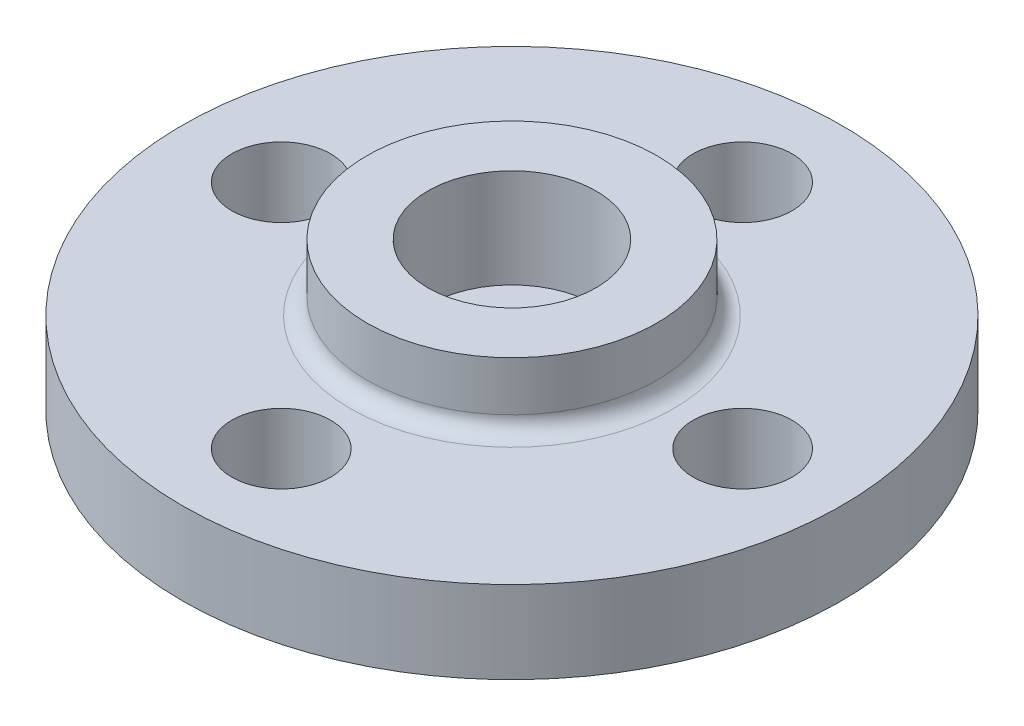
ISO-10303-21;
HEADER;
FILE_DESCRIPTION(('STEP AP214'),'2;1');
FILE_NAME('part.step','',(''),(''),'','','');
FILE_SCHEMA(('AUTOMOTIVE_DESIGN { 1 0 10303 214 1 1 1 1 }'));
ENDSEC;
DATA;
#1=APPLICATION_CONTEXT('core data for automotive mechanical design processes');
#2=APPLICATION_PROTOCOL_DEFINITION('international standard','automotive_design',2000,#1);
#3=PRODUCT_CONTEXT('',#1,'mechanical');
#4=PRODUCT('Part','Part','',(#3));
#5=PRODUCT_RELATED_PRODUCT_CATEGORY('part','',(#4));
#6=PRODUCT_DEFINITION_FORMATION('','',#4);
#7=PRODUCT_DEFINITION_CONTEXT('part definition',#1,'design');
#8=PRODUCT_DEFINITION('design','',#6,#7);
#9=PRODUCT_DEFINITION_SHAPE('','',#8);
#10=(LENGTH_UNIT() NAMED_UNIT(*) SI_UNIT(.MILLI.,.METRE.));
#11=(NAMED_UNIT(*) PLANE_ANGLE_UNIT() SI_UNIT($,.RADIAN.));
#12=(NAMED_UNIT(*) SI_UNIT($,.STERADIAN.) SOLID_ANGLE_UNIT());
#13=UNCERTAINTY_MEASURE_WITH_UNIT(LENGTH_MEASURE(1.E-05),#10,'distance_accuracy_value','');
#14=(GEOMETRIC_REPRESENTATION_CONTEXT(3) GLOBAL_UNCERTAINTY_ASSIGNED_CONTEXT((#13)) GLOBAL_UNIT_ASSIGNED_CONTEXT((#10,
#11,#12)) REPRESENTATION_CONTEXT('',''));
#15=CARTESIAN_POINT('',(0.,0.,0.));
#16=DIRECTION('',(0.,0.,1.));
#17=DIRECTION('',(1.,0.,0.));
#18=AXIS2_PLACEMENT_3D('',#15,#16,#17);
#19=CARTESIAN_POINT('',(0.,2.5,0.));
#20=DIRECTION('',(0.,-1.,0.));
#21=DIRECTION('',(0.,0.,-1.));
#22=AXIS2_PLACEMENT_3D('',#19,#20,#21);
#23=CYLINDRICAL_SURFACE('',#22,1.5);
#24=CARTESIAN_POINT('',(0.,0.,0.));
#25=DIRECTION('',(0.,1.,0.));
#26=DIRECTION('',(0.,0.,1.));
#27=AXIS2_PLACEMENT_3D('',#24,#25,#26);
#28=CIRCLE('',#27,1.5);
#29=CARTESIAN_POINT('',(0.,0.,1.5));
#30=VERTEX_POINT('',#29);
#31=EDGE_CURVE('E74',#30,#30,#28,.T.);
#32=ORIENTED_EDGE('',*,*,#31,.F.);
#33=EDGE_LOOP('',(#32));
#34=FACE_BOUND('',#33,.T.);
#35=CARTESIAN_POINT('',(0.,1.5,0.));
#36=DIRECTION('',(0.,1.,0.));
#37=DIRECTION('',(0.,0.,1.));
#38=AXIS2_PLACEMENT_3D('',#35,#36,#37);
#39=CIRCLE('',#38,1.5);
#40=CARTESIAN_POINT('',(0.,1.5,1.5));
#41=VERTEX_POINT('',#40);
#42=EDGE_CURVE('E36',#41,#41,#39,.T.);
#43=ORIENTED_EDGE('',*,*,#42,.T.);
#44=EDGE_LOOP('',(#43));
#45=FACE_BOUND('',#44,.T.);
#46=ADVANCED_FACE('F32',(#34,#45),#23,.F.);
#47=CARTESIAN_POINT('',(0.,2.5,0.));
#48=DIRECTION('',(0.,1.,0.));
#49=DIRECTION('',(0.,0.,1.));
#50=AXIS2_PLACEMENT_3D('',#47,#48,#49);
#51=PLANE('',#50);
#52=CARTESIAN_POINT('',(0.,2.5,0.));
#53=DIRECTION('',(0.,1.,0.));
#54=DIRECTION('',(0.,0.,1.));
#55=AXIS2_PLACEMENT_3D('',#52,#53,#54);
#56=CIRCLE('',#55,4.9);
#57=CARTESIAN_POINT('',(0.,2.5,4.9));
#58=VERTEX_POINT('',#57);
#59=EDGE_CURVE('E10',#58,#58,#56,.F.);
#60=ORIENTED_EDGE('',*,*,#59,.T.);
#61=EDGE_LOOP('',(#60));
#62=FACE_BOUND('',#61,.T.);
#63=CARTESIAN_POINT('',(-7.,2.5,0.));
#64=DIRECTION('',(0.,1.,0.));
#65=DIRECTION('',(0.,0.,1.));
#66=AXIS2_PLACEMENT_3D('',#63,#64,#65);
#67=CIRCLE('',#66,1.5);
#68=CARTESIAN_POINT('',(-7.,2.5,1.5));
#69=VERTEX_POINT('',#68);
#70=EDGE_CURVE('E68',#69,#69,#67,.T.);
#71=ORIENTED_EDGE('',*,*,#70,.F.);
#72=EDGE_LOOP('',(#71));
#73=FACE_BOUND('',#72,.T.);
#74=CARTESIAN_POINT('',(0.,2.5,-7.));
#75=DIRECTION('',(0.,1.,0.));
#76=DIRECTION('',(0.,0.,1.));
#77=AXIS2_PLACEMENT_3D('',#74,#75,#76);
#78=CIRCLE('',#77,1.5);
#79=CARTESIAN_POINT('',(0.,2.5,-5.5));
#80=VERTEX_POINT('',#79);
#81=EDGE_CURVE('E56',#80,#80,#78,.T.);
#82=ORIENTED_EDGE('',*,*,#81,.F.);
#83=EDGE_LOOP('',(#82));
#84=FACE_BOUND('',#83,.T.);
#85=CARTESIAN_POINT('',(0.,2.5,0.));
#86=DIRECTION('',(0.,1.,0.));
#87=DIRECTION('',(0.,0.,1.));
#88=AXIS2_PLACEMENT_3D('',#85,#86,#87);
#89=CIRCLE('',#88,10.);
#90=CARTESIAN_POINT('',(0.,2.5,10.));
#91=VERTEX_POINT('',#90);
#92=EDGE_CURVE('E44',#91,#91,#89,.T.);
#93=ORIENTED_EDGE('',*,*,#92,.T.);
#94=EDGE_LOOP('',(#93));
#95=FACE_BOUND('',#94,.T.);
#96=CARTESIAN_POINT('',(7.,2.5,0.));
#97=DIRECTION('',(0.,1.,0.));
#98=DIRECTION('',(0.,0.,1.));
#99=AXIS2_PLACEMENT_3D('',#96,#97,#98);
#100=CIRCLE('',#99,1.5);
#101=CARTESIAN_POINT('',(7.,2.5,1.5));
#102=VERTEX_POINT('',#101);
#103=EDGE_CURVE('E50',#102,#102,#100,.T.);
#104=ORIENTED_EDGE('',*,*,#103,.F.);
#105=EDGE_LOOP('',(#104));
#106=FACE_BOUND('',#105,.T.);
#107=CARTESIAN_POINT('',(0.,2.5,7.));
#108=DIRECTION('',(0.,1.,0.));
#109=DIRECTION('',(0.,0.,1.));
#110=AXIS2_PLACEMENT_3D('',#107,#108,#109);
#111=CIRCLE('',#110,1.5);
#112=CARTESIAN_POINT('',(0.,2.5,8.5));
#113=VERTEX_POINT('',#112);
#114=EDGE_CURVE('E62',#113,#113,#111,.T.);
#115=ORIENTED_EDGE('',*,*,#114,.F.);
#116=EDGE_LOOP('',(#115));
#117=FACE_BOUND('',#116,.T.);
#118=ADVANCED_FACE('F103',(#62,#73,#84,#95,#106,#117),#51,.T.);
#119=CARTESIAN_POINT('',(0.,0.,0.));
#120=DIRECTION('',(0.,1.,0.));
#121=DIRECTION('',(0.,0.,1.));
#122=AXIS2_PLACEMENT_3D('',#119,#120,#121);
#123=PLANE('',#122);
#124=CARTESIAN_POINT('',(0.,0.,0.));
#125=DIRECTION('',(0.,1.,0.));
#126=DIRECTION('',(0.,0.,1.));
#127=AXIS2_PLACEMENT_3D('',#124,#125,#126);
#128=CIRCLE('',#127,10.);
#129=CARTESIAN_POINT('',(0.,0.,10.));
#130=VERTEX_POINT('',#129);
#131=EDGE_CURVE('E47',#130,#130,#128,.T.);
#132=ORIENTED_EDGE('',*,*,#131,.F.);
#133=EDGE_LOOP('',(#132));
#134=FACE_BOUND('',#133,.T.);
#135=CARTESIAN_POINT('',(7.,0.,0.));
#136=DIRECTION('',(0.,1.,0.));
#137=DIRECTION('',(0.,0.,1.));
#138=AXIS2_PLACEMENT_3D('',#135,#136,#137);
#139=CIRCLE('',#138,1.5);
#140=CARTESIAN_POINT('',(7.,0.,1.5));
#141=VERTEX_POINT('',#140);
#142=EDGE_CURVE('E53',#141,#141,#139,.T.);
#143=ORIENTED_EDGE('',*,*,#142,.T.);
#144=EDGE_LOOP('',(#143));
#145=FACE_BOUND('',#144,.T.);
#146=CARTESIAN_POINT('',(0.,0.,-7.));
#147=DIRECTION('',(0.,1.,0.));
#148=DIRECTION('',(0.,0.,1.));
#149=AXIS2_PLACEMENT_3D('',#146,#147,#148);
#150=CIRCLE('',#149,1.5);
#151=CARTESIAN_POINT('',(0.,0.,-5.5));
#152=VERTEX_POINT('',#151);
#153=EDGE_CURVE('E59',#152,#152,#150,.T.);
#154=ORIENTED_EDGE('',*,*,#153,.T.);
#155=EDGE_LOOP('',(#154));
#156=FACE_BOUND('',#155,.T.);
#157=CARTESIAN_POINT('',(0.,0.,7.));
#158=DIRECTION('',(0.,1.,0.));
#159=DIRECTION('',(0.,0.,1.));
#160=AXIS2_PLACEMENT_3D('',#157,#158,#159);
#161=CIRCLE('',#160,1.5);
#162=CARTESIAN_POINT('',(0.,0.,8.5));
#163=VERTEX_POINT('',#162);
#164=EDGE_CURVE('E65',#163,#163,#161,.T.);
#165=ORIENTED_EDGE('',*,*,#164,.T.);
#166=EDGE_LOOP('',(#165));
#167=FACE_BOUND('',#166,.T.);
#168=CARTESIAN_POINT('',(-7.,0.,0.));
#169=DIRECTION('',(0.,1.,0.));
#170=DIRECTION('',(0.,0.,1.));
#171=AXIS2_PLACEMENT_3D('',#168,#169,#170);
#172=CIRCLE('',#171,1.5);
#173=CARTESIAN_POINT('',(-7.,0.,1.5));
#174=VERTEX_POINT('',#173);
#175=EDGE_CURVE('E71',#174,#174,#172,.T.);
#176=ORIENTED_EDGE('',*,*,#175,.T.);
#177=EDGE_LOOP('',(#176));
#178=FACE_BOUND('',#177,.T.);
#179=ORIENTED_EDGE('',*,*,#31,.T.);
#180=EDGE_LOOP('',(#179));
#181=FACE_BOUND('',#180,.T.);
#182=ADVANCED_FACE('F109',(#134,#145,#156,#167,#178,#181),#123,.F.);
#183=CARTESIAN_POINT('',(0.,2.5,0.));
#184=DIRECTION('',(0.,-1.,0.));
#185=DIRECTION('',(0.,0.,-1.));
#186=AXIS2_PLACEMENT_3D('',#183,#184,#185);
#187=CYLINDRICAL_SURFACE('',#186,10.);
#188=ORIENTED_EDGE('',*,*,#92,.F.);
#189=EDGE_LOOP('',(#188));
#190=FACE_BOUND('',#189,.T.);
#191=ORIENTED_EDGE('',*,*,#131,.T.);
#192=EDGE_LOOP('',(#191));
#193=FACE_BOUND('',#192,.T.);
#194=ADVANCED_FACE('F131',(#190,#193),#187,.T.);
#195=CARTESIAN_POINT('',(7.,2.5,0.));
#196=DIRECTION('',(0.,-1.,0.));
#197=DIRECTION('',(0.,0.,-1.));
#198=AXIS2_PLACEMENT_3D('',#195,#196,#197);
#199=CYLINDRICAL_SURFACE('',#198,1.5);
#200=ORIENTED_EDGE('',*,*,#103,.T.);
#201=EDGE_LOOP('',(#200));
#202=FACE_BOUND('',#201,.T.);
#203=ORIENTED_EDGE('',*,*,#142,.F.);
#204=EDGE_LOOP('',(#203));
#205=FACE_BOUND('',#204,.T.);
#206=ADVANCED_FACE('F128',(#202,#205),#199,.F.);
#207=CARTESIAN_POINT('',(0.,2.5,-7.));
#208=DIRECTION('',(0.,-1.,0.));
#209=DIRECTION('',(0.,0.,-1.));
#210=AXIS2_PLACEMENT_3D('',#207,#208,#209);
#211=CYLINDRICAL_SURFACE('',#210,1.5);
#212=ORIENTED_EDGE('',*,*,#81,.T.);
#213=EDGE_LOOP('',(#212));
#214=FACE_BOUND('',#213,.T.);
#215=ORIENTED_EDGE('',*,*,#153,.F.);
#216=EDGE_LOOP('',(#215));
#217=FACE_BOUND('',#216,.T.);
#218=ADVANCED_FACE('F124',(#214,#217),#211,.F.);
#219=CARTESIAN_POINT('',(0.,2.5,7.));
#220=DIRECTION('',(0.,-1.,0.));
#221=DIRECTION('',(0.,0.,-1.));
#222=AXIS2_PLACEMENT_3D('',#219,#220,#221);
#223=CYLINDRICAL_SURFACE('',#222,1.5);
#224=ORIENTED_EDGE('',*,*,#114,.T.);
#225=EDGE_LOOP('',(#224));
#226=FACE_BOUND('',#225,.T.);
#227=ORIENTED_EDGE('',*,*,#164,.F.);
#228=EDGE_LOOP('',(#227));
#229=FACE_BOUND('',#228,.T.);
#230=ADVANCED_FACE('F120',(#226,#229),#223,.F.);
#231=CARTESIAN_POINT('',(-7.,2.5,0.));
#232=DIRECTION('',(0.,-1.,0.));
#233=DIRECTION('',(0.,0.,-1.));
#234=AXIS2_PLACEMENT_3D('',#231,#232,#233);
#235=CYLINDRICAL_SURFACE('',#234,1.5);
#236=ORIENTED_EDGE('',*,*,#70,.T.);
#237=EDGE_LOOP('',(#236));
#238=FACE_BOUND('',#237,.T.);
#239=ORIENTED_EDGE('',*,*,#175,.F.);
#240=EDGE_LOOP('',(#239));
#241=FACE_BOUND('',#240,.T.);
#242=ADVANCED_FACE('F116',(#238,#241),#235,.F.);
#243=CARTESIAN_POINT('',(0.,4.5,0.));
#244=DIRECTION('',(0.,1.,0.));
#245=DIRECTION('',(0.,0.,1.));
#246=AXIS2_PLACEMENT_3D('',#243,#244,#245);
#247=PLANE('',#246);
#248=CARTESIAN_POINT('',(0.,4.5,0.));
#249=DIRECTION('',(0.,1.,0.));
#250=DIRECTION('',(0.,0.,1.));
#251=AXIS2_PLACEMENT_3D('',#248,#249,#250);
#252=CIRCLE('',#251,4.4);
#253=CARTESIAN_POINT('',(0.,4.5,4.4));
#254=VERTEX_POINT('',#253);
#255=EDGE_CURVE('E79',#254,#254,#252,.T.);
#256=ORIENTED_EDGE('',*,*,#255,.T.);
#257=EDGE_LOOP('',(#256));
#258=FACE_BOUND('',#257,.T.);
#259=CARTESIAN_POINT('',(0.,4.5,0.));
#260=DIRECTION('',(0.,1.,0.));
#261=DIRECTION('',(0.,0.,1.));
#262=AXIS2_PLACEMENT_3D('',#259,#260,#261);
#263=CIRCLE('',#262,2.55);
#264=CARTESIAN_POINT('',(0.,4.5,2.55));
#265=VERTEX_POINT('',#264);
#266=EDGE_CURVE('E82',#265,#265,#263,.T.);
#267=ORIENTED_EDGE('',*,*,#266,.F.);
#268=EDGE_LOOP('',(#267));
#269=FACE_BOUND('',#268,.T.);
#270=ADVANCED_FACE('F119',(#258,#269),#247,.T.);
#271=CARTESIAN_POINT('',(0.,4.5,0.));
#272=DIRECTION('',(0.,-1.,0.));
#273=DIRECTION('',(0.,0.,-1.));
#274=AXIS2_PLACEMENT_3D('',#271,#272,#273);
#275=CYLINDRICAL_SURFACE('',#274,4.4);
#276=CARTESIAN_POINT('',(0.,3.,0.));
#277=DIRECTION('',(0.,1.,0.));
#278=DIRECTION('',(0.,0.,1.));
#279=AXIS2_PLACEMENT_3D('',#276,#277,#278);
#280=CIRCLE('',#279,4.4);
#281=CARTESIAN_POINT('',(0.,3.,4.4));
#282=VERTEX_POINT('',#281);
#283=EDGE_CURVE('E40',#282,#282,#280,.T.);
#284=ORIENTED_EDGE('',*,*,#283,.T.);
#285=EDGE_LOOP('',(#284));
#286=FACE_BOUND('',#285,.T.);
#287=ORIENTED_EDGE('',*,*,#255,.F.);
#288=EDGE_LOOP('',(#287));
#289=FACE_BOUND('',#288,.T.);
#290=ADVANCED_FACE('F114',(#286,#289),#275,.T.);
#291=CARTESIAN_POINT('',(0.,4.5,0.));
#292=DIRECTION('',(0.,-1.,0.));
#293=DIRECTION('',(0.,0.,-1.));
#294=AXIS2_PLACEMENT_3D('',#291,#292,#293);
#295=CYLINDRICAL_SURFACE('',#294,2.55);
#296=ORIENTED_EDGE('',*,*,#266,.T.);
#297=EDGE_LOOP('',(#296));
#298=FACE_BOUND('',#297,.T.);
#299=CARTESIAN_POINT('',(0.,1.5,0.));
#300=DIRECTION('',(0.,1.,0.));
#301=DIRECTION('',(0.,0.,1.));
#302=AXIS2_PLACEMENT_3D('',#299,#300,#301);
#303=CIRCLE('',#302,2.55);
#304=CARTESIAN_POINT('',(0.,1.5,2.55));
#305=VERTEX_POINT('',#304);
#306=EDGE_CURVE('E85',#305,#305,#303,.T.);
#307=ORIENTED_EDGE('',*,*,#306,.F.);
#308=EDGE_LOOP('',(#307));
#309=FACE_BOUND('',#308,.T.);
#310=ADVANCED_FACE('F99',(#298,#309),#295,.F.);
#311=CARTESIAN_POINT('',(0.,3.,0.));
#312=DIRECTION('',(0.,1.,0.));
#313=DIRECTION('',(0.,0.,1.));
#314=AXIS2_PLACEMENT_3D('',#311,#312,#313);
#315=TOROIDAL_SURFACE('',#314,4.9,0.5);
#316=ORIENTED_EDGE('',*,*,#59,.F.);
#317=EDGE_LOOP('',(#316));
#318=FACE_BOUND('',#317,.T.);
#319=ORIENTED_EDGE('',*,*,#283,.F.);
#320=EDGE_LOOP('',(#319));
#321=FACE_BOUND('',#320,.T.);
#322=ADVANCED_FACE('F34',(#318,#321),#315,.F.);
#323=CARTESIAN_POINT('',(0.,1.5,0.));
#324=DIRECTION('',(0.,1.,0.));
#325=DIRECTION('',(0.,0.,1.));
#326=AXIS2_PLACEMENT_3D('',#323,#324,#325);
#327=PLANE('',#326);
#328=ORIENTED_EDGE('',*,*,#42,.F.);
#329=EDGE_LOOP('',(#328));
#330=FACE_BOUND('',#329,.T.);
#331=ORIENTED_EDGE('',*,*,#306,.T.);
#332=EDGE_LOOP('',(#331));
#333=FACE_BOUND('',#332,.T.);
#334=ADVANCED_FACE('F93',(#330,#333),#327,.T.);
#335=CLOSED_SHELL('',(#46,#118,#182,#194,#206,#218,#230,#242,#270,#290,#310,#322,#334));
#336=MANIFOLD_SOLID_BREP('B2',#335);
#337=ADVANCED_BREP_SHAPE_REPRESENTATION('',(#18,#336),#14);
#338=SHAPE_DEFINITION_REPRESENTATION(#9,#337);
ENDSEC;
END-ISO-10303-21;
